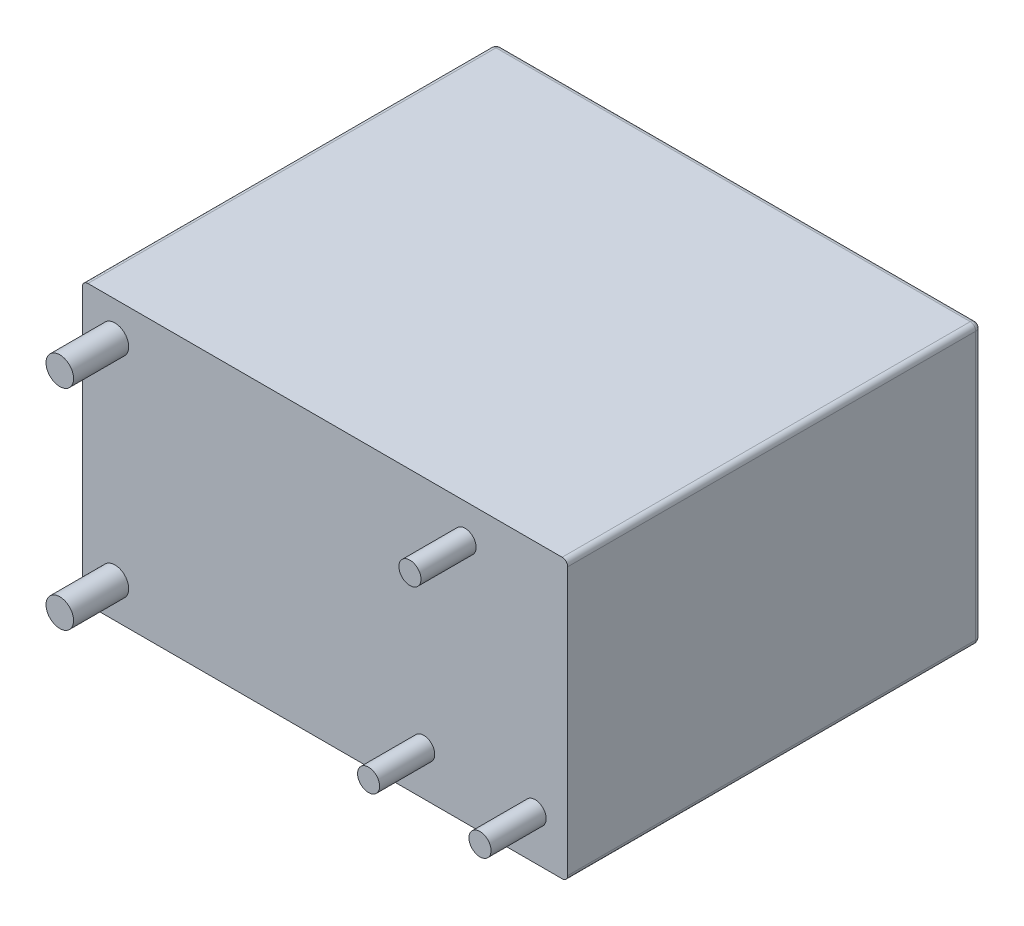
ISO-10303-21;
HEADER;
FILE_DESCRIPTION(('STEP AP214'),'2;1');
FILE_NAME('part.step','',(''),(''),'','','');
FILE_SCHEMA(('AUTOMOTIVE_DESIGN { 1 0 10303 214 1 1 1 1 }'));
ENDSEC;
DATA;
#1=APPLICATION_CONTEXT('core data for automotive mechanical design processes');
#2=APPLICATION_PROTOCOL_DEFINITION('international standard','automotive_design',2000,#1);
#3=PRODUCT_CONTEXT('',#1,'mechanical');
#4=PRODUCT('Part','Part','',(#3));
#5=PRODUCT_RELATED_PRODUCT_CATEGORY('part','',(#4));
#6=PRODUCT_DEFINITION_FORMATION('','',#4);
#7=PRODUCT_DEFINITION_CONTEXT('part definition',#1,'design');
#8=PRODUCT_DEFINITION('design','',#6,#7);
#9=PRODUCT_DEFINITION_SHAPE('','',#8);
#10=(LENGTH_UNIT() NAMED_UNIT(*) SI_UNIT(.MILLI.,.METRE.));
#11=(NAMED_UNIT(*) PLANE_ANGLE_UNIT() SI_UNIT($,.RADIAN.));
#12=(NAMED_UNIT(*) SI_UNIT($,.STERADIAN.) SOLID_ANGLE_UNIT());
#13=UNCERTAINTY_MEASURE_WITH_UNIT(LENGTH_MEASURE(1.E-05),#10,'distance_accuracy_value','');
#14=(GEOMETRIC_REPRESENTATION_CONTEXT(3) GLOBAL_UNCERTAINTY_ASSIGNED_CONTEXT((#13)) GLOBAL_UNIT_ASSIGNED_CONTEXT((#10,
#11,#12)) REPRESENTATION_CONTEXT('',''));
#15=CARTESIAN_POINT('',(0.,0.,0.));
#16=DIRECTION('',(0.,0.,1.));
#17=DIRECTION('',(1.,0.,0.));
#18=AXIS2_PLACEMENT_3D('',#15,#16,#17);
#19=CARTESIAN_POINT('',(0.,0.,-15.));
#20=DIRECTION('',(-1.,0.,0.));
#21=DIRECTION('',(0.,0.,1.));
#22=AXIS2_PLACEMENT_3D('',#19,#20,#21);
#23=PLANE('',#22);
#24=DIRECTION('',(0.,-1.,0.));
#25=VECTOR('',#24,1.);
#26=CARTESIAN_POINT('',(0.,0.,-14.8));
#27=LINE('',#26,#25);
#28=CARTESIAN_POINT('',(0.,9.9,-14.8));
#29=VERTEX_POINT('',#28);
#30=CARTESIAN_POINT('',(0.,0.2,-14.8));
#31=VERTEX_POINT('',#30);
#32=EDGE_CURVE('E156',#29,#31,#27,.T.);
#33=ORIENTED_EDGE('',*,*,#32,.T.);
#34=DIRECTION('',(0.,0.,1.));
#35=VECTOR('',#34,1.);
#36=CARTESIAN_POINT('',(0.,0.2,-15.));
#37=LINE('',#36,#35);
#38=CARTESIAN_POINT('',(0.,0.2,0.));
#39=VERTEX_POINT('',#38);
#40=EDGE_CURVE('E158',#31,#39,#37,.T.);
#41=ORIENTED_EDGE('',*,*,#40,.T.);
#42=DIRECTION('',(0.,-1.,0.));
#43=VECTOR('',#42,1.);
#44=CARTESIAN_POINT('',(0.,0.,0.));
#45=LINE('',#44,#43);
#46=CARTESIAN_POINT('',(0.,9.9,0.));
#47=VERTEX_POINT('',#46);
#48=EDGE_CURVE('E117',#47,#39,#45,.T.);
#49=ORIENTED_EDGE('',*,*,#48,.F.);
#50=DIRECTION('',(0.,0.,1.));
#51=VECTOR('',#50,1.);
#52=CARTESIAN_POINT('',(0.,9.9,-15.));
#53=LINE('',#52,#51);
#54=EDGE_CURVE('E154',#47,#29,#53,.F.);
#55=ORIENTED_EDGE('',*,*,#54,.T.);
#56=EDGE_LOOP('',(#33,#41,#49,#55));
#57=FACE_BOUND('',#56,.T.);
#58=ADVANCED_FACE('F35',(#57),#23,.T.);
#59=CARTESIAN_POINT('',(0.,10.1,-15.));
#60=DIRECTION('',(0.,1.,0.));
#61=DIRECTION('',(0.,0.,1.));
#62=AXIS2_PLACEMENT_3D('',#59,#60,#61);
#63=PLANE('',#62);
#64=DIRECTION('',(-1.,0.,0.));
#65=VECTOR('',#64,1.);
#66=CARTESIAN_POINT('',(0.,10.1,-14.8));
#67=LINE('',#66,#65);
#68=CARTESIAN_POINT('',(17.4,10.1,-14.8));
#69=VERTEX_POINT('',#68);
#70=CARTESIAN_POINT('',(0.2,10.1,-14.8));
#71=VERTEX_POINT('',#70);
#72=EDGE_CURVE('E51',#69,#71,#67,.T.);
#73=ORIENTED_EDGE('',*,*,#72,.T.);
#74=DIRECTION('',(0.,0.,1.));
#75=VECTOR('',#74,1.);
#76=CARTESIAN_POINT('',(0.2,10.1,-15.));
#77=LINE('',#76,#75);
#78=CARTESIAN_POINT('',(0.2,10.1,0.));
#79=VERTEX_POINT('',#78);
#80=EDGE_CURVE('E11',#71,#79,#77,.T.);
#81=ORIENTED_EDGE('',*,*,#80,.T.);
#82=DIRECTION('',(-1.,0.,0.));
#83=VECTOR('',#82,1.);
#84=CARTESIAN_POINT('',(0.,10.1,0.));
#85=LINE('',#84,#83);
#86=CARTESIAN_POINT('',(17.4,10.1,0.));
#87=VERTEX_POINT('',#86);
#88=EDGE_CURVE('E231',#87,#79,#85,.T.);
#89=ORIENTED_EDGE('',*,*,#88,.F.);
#90=DIRECTION('',(0.,0.,1.));
#91=VECTOR('',#90,1.);
#92=CARTESIAN_POINT('',(17.4,10.1,-15.));
#93=LINE('',#92,#91);
#94=EDGE_CURVE('E44',#87,#69,#93,.F.);
#95=ORIENTED_EDGE('',*,*,#94,.T.);
#96=EDGE_LOOP('',(#73,#81,#89,#95));
#97=FACE_BOUND('',#96,.T.);
#98=ADVANCED_FACE('F276',(#97),#63,.T.);
#99=CARTESIAN_POINT('',(17.6,0.,-15.));
#100=DIRECTION('',(1.,0.,0.));
#101=DIRECTION('',(0.,0.,-1.));
#102=AXIS2_PLACEMENT_3D('',#99,#100,#101);
#103=PLANE('',#102);
#104=DIRECTION('',(0.,1.,0.));
#105=VECTOR('',#104,1.);
#106=CARTESIAN_POINT('',(17.6,0.,0.));
#107=LINE('',#106,#105);
#108=CARTESIAN_POINT('',(17.6,0.2,0.));
#109=VERTEX_POINT('',#108);
#110=CARTESIAN_POINT('',(17.6,9.9,0.));
#111=VERTEX_POINT('',#110);
#112=EDGE_CURVE('E131',#109,#111,#107,.T.);
#113=ORIENTED_EDGE('',*,*,#112,.F.);
#114=DIRECTION('',(0.,0.,1.));
#115=VECTOR('',#114,1.);
#116=CARTESIAN_POINT('',(17.6,0.2,-15.));
#117=LINE('',#116,#115);
#118=CARTESIAN_POINT('',(17.6,0.2,-14.8));
#119=VERTEX_POINT('',#118);
#120=EDGE_CURVE('E152',#109,#119,#117,.F.);
#121=ORIENTED_EDGE('',*,*,#120,.T.);
#122=DIRECTION('',(0.,1.,0.));
#123=VECTOR('',#122,1.);
#124=CARTESIAN_POINT('',(17.6,0.,-14.8));
#125=LINE('',#124,#123);
#126=CARTESIAN_POINT('',(17.6,9.9,-14.8));
#127=VERTEX_POINT('',#126);
#128=EDGE_CURVE('E150',#119,#127,#125,.T.);
#129=ORIENTED_EDGE('',*,*,#128,.T.);
#130=DIRECTION('',(0.,0.,1.));
#131=VECTOR('',#130,1.);
#132=CARTESIAN_POINT('',(17.6,9.9,-15.));
#133=LINE('',#132,#131);
#134=EDGE_CURVE('E148',#127,#111,#133,.T.);
#135=ORIENTED_EDGE('',*,*,#134,.T.);
#136=EDGE_LOOP('',(#113,#121,#129,#135));
#137=FACE_BOUND('',#136,.T.);
#138=ADVANCED_FACE('F282',(#137),#103,.T.);
#139=CARTESIAN_POINT('',(0.,0.,-15.));
#140=DIRECTION('',(0.,-1.,0.));
#141=DIRECTION('',(0.,0.,-1.));
#142=AXIS2_PLACEMENT_3D('',#139,#140,#141);
#143=PLANE('',#142);
#144=DIRECTION('',(1.,0.,0.));
#145=VECTOR('',#144,1.);
#146=CARTESIAN_POINT('',(0.,0.,-14.8));
#147=LINE('',#146,#145);
#148=CARTESIAN_POINT('',(0.2,0.,-14.8));
#149=VERTEX_POINT('',#148);
#150=CARTESIAN_POINT('',(17.4,0.,-14.8));
#151=VERTEX_POINT('',#150);
#152=EDGE_CURVE('E137',#149,#151,#147,.T.);
#153=ORIENTED_EDGE('',*,*,#152,.T.);
#154=DIRECTION('',(0.,0.,1.));
#155=VECTOR('',#154,1.);
#156=CARTESIAN_POINT('',(17.4,0.,-15.));
#157=LINE('',#156,#155);
#158=CARTESIAN_POINT('',(17.4,0.,0.));
#159=VERTEX_POINT('',#158);
#160=EDGE_CURVE('E130',#151,#159,#157,.T.);
#161=ORIENTED_EDGE('',*,*,#160,.T.);
#162=DIRECTION('',(1.,0.,0.));
#163=VECTOR('',#162,1.);
#164=CARTESIAN_POINT('',(0.,0.,0.));
#165=LINE('',#164,#163);
#166=CARTESIAN_POINT('',(0.2,0.,0.));
#167=VERTEX_POINT('',#166);
#168=EDGE_CURVE('E115',#167,#159,#165,.T.);
#169=ORIENTED_EDGE('',*,*,#168,.F.);
#170=DIRECTION('',(0.,0.,1.));
#171=VECTOR('',#170,1.);
#172=CARTESIAN_POINT('',(0.2,0.,-15.));
#173=LINE('',#172,#171);
#174=EDGE_CURVE('E127',#167,#149,#173,.F.);
#175=ORIENTED_EDGE('',*,*,#174,.T.);
#176=EDGE_LOOP('',(#153,#161,#169,#175));
#177=FACE_BOUND('',#176,.T.);
#178=ADVANCED_FACE('F126',(#177),#143,.T.);
#179=CARTESIAN_POINT('',(0.,0.,-15.));
#180=DIRECTION('',(0.,0.,-1.));
#181=DIRECTION('',(-1.,0.,0.));
#182=AXIS2_PLACEMENT_3D('',#179,#180,#181);
#183=PLANE('',#182);
#184=CARTESIAN_POINT('',(15.4,8.1,-15.));
#185=DIRECTION('',(0.,0.,-1.));
#186=DIRECTION('',(-1.,0.,0.));
#187=AXIS2_PLACEMENT_3D('',#184,#185,#186);
#188=CIRCLE('',#187,0.500000000000001);
#189=CARTESIAN_POINT('',(14.9,8.1,-15.));
#190=VERTEX_POINT('',#189);
#191=EDGE_CURVE('E217',#190,#190,#188,.T.);
#192=ORIENTED_EDGE('',*,*,#191,.F.);
#193=EDGE_LOOP('',(#192));
#194=FACE_BOUND('',#193,.T.);
#195=DIRECTION('',(0.,1.,0.));
#196=VECTOR('',#195,1.);
#197=CARTESIAN_POINT('',(17.4,0.,-15.));
#198=LINE('',#197,#196);
#199=CARTESIAN_POINT('',(17.4,9.9,-15.));
#200=VERTEX_POINT('',#199);
#201=CARTESIAN_POINT('',(17.4,0.2,-15.));
#202=VERTEX_POINT('',#201);
#203=EDGE_CURVE('E164',#200,#202,#198,.F.);
#204=ORIENTED_EDGE('',*,*,#203,.T.);
#205=DIRECTION('',(1.,0.,0.));
#206=VECTOR('',#205,1.);
#207=CARTESIAN_POINT('',(0.,0.2,-15.));
#208=LINE('',#207,#206);
#209=CARTESIAN_POINT('',(0.2,0.2,-15.));
#210=VERTEX_POINT('',#209);
#211=EDGE_CURVE('E166',#202,#210,#208,.F.);
#212=ORIENTED_EDGE('',*,*,#211,.T.);
#213=DIRECTION('',(0.,-1.,0.));
#214=VECTOR('',#213,1.);
#215=CARTESIAN_POINT('',(0.2,0.,-15.));
#216=LINE('',#215,#214);
#217=CARTESIAN_POINT('',(0.2,9.9,-15.));
#218=VERTEX_POINT('',#217);
#219=EDGE_CURVE('E162',#210,#218,#216,.F.);
#220=ORIENTED_EDGE('',*,*,#219,.T.);
#221=DIRECTION('',(-1.,0.,0.));
#222=VECTOR('',#221,1.);
#223=CARTESIAN_POINT('',(0.,9.9,-15.));
#224=LINE('',#223,#222);
#225=EDGE_CURVE('E160',#218,#200,#224,.F.);
#226=ORIENTED_EDGE('',*,*,#225,.T.);
#227=EDGE_LOOP('',(#204,#212,#220,#226));
#228=FACE_BOUND('',#227,.T.);
#229=ADVANCED_FACE('F253',(#194,#228),#183,.T.);
#230=CARTESIAN_POINT('',(0.,0.,0.));
#231=DIRECTION('',(0.,0.,-1.));
#232=DIRECTION('',(-1.,0.,0.));
#233=AXIS2_PLACEMENT_3D('',#230,#231,#232);
#234=PLANE('',#233);
#235=CARTESIAN_POINT('',(1.18,1.25,0.));
#236=DIRECTION('',(0.,0.,-1.));
#237=DIRECTION('',(-1.,0.,0.));
#238=AXIS2_PLACEMENT_3D('',#235,#236,#237);
#239=CIRCLE('',#238,0.5);
#240=CARTESIAN_POINT('',(0.68,1.25,0.));
#241=VERTEX_POINT('',#240);
#242=EDGE_CURVE('E141',#241,#241,#239,.F.);
#243=ORIENTED_EDGE('',*,*,#242,.F.);
#244=EDGE_LOOP('',(#243));
#245=FACE_BOUND('',#244,.T.);
#246=CARTESIAN_POINT('',(16.42,1.5969825328216,0.));
#247=DIRECTION('',(0.,0.,-1.));
#248=DIRECTION('',(-1.,0.,0.));
#249=AXIS2_PLACEMENT_3D('',#246,#247,#248);
#250=CIRCLE('',#249,0.400000000000001);
#251=CARTESIAN_POINT('',(16.02,1.5969825328216,0.));
#252=VERTEX_POINT('',#251);
#253=EDGE_CURVE('E243',#252,#252,#250,.F.);
#254=ORIENTED_EDGE('',*,*,#253,.F.);
#255=EDGE_LOOP('',(#254));
#256=FACE_BOUND('',#255,.T.);
#257=CARTESIAN_POINT('',(12.38,1.59698253282159,0.));
#258=DIRECTION('',(0.,0.,-1.));
#259=DIRECTION('',(-1.,0.,0.));
#260=AXIS2_PLACEMENT_3D('',#257,#258,#259);
#261=CIRCLE('',#260,0.399999999999999);
#262=CARTESIAN_POINT('',(11.98,1.59698253282159,0.));
#263=VERTEX_POINT('',#262);
#264=EDGE_CURVE('E240',#263,#263,#261,.F.);
#265=ORIENTED_EDGE('',*,*,#264,.F.);
#266=EDGE_LOOP('',(#265));
#267=FACE_BOUND('',#266,.T.);
#268=CARTESIAN_POINT('',(13.88,8.85,0.));
#269=DIRECTION('',(0.,0.,-1.));
#270=DIRECTION('',(-1.,0.,0.));
#271=AXIS2_PLACEMENT_3D('',#268,#269,#270);
#272=CIRCLE('',#271,0.399999999999999);
#273=CARTESIAN_POINT('',(13.48,8.85,0.));
#274=VERTEX_POINT('',#273);
#275=EDGE_CURVE('E237',#274,#274,#272,.F.);
#276=ORIENTED_EDGE('',*,*,#275,.F.);
#277=EDGE_LOOP('',(#276));
#278=FACE_BOUND('',#277,.T.);
#279=CARTESIAN_POINT('',(1.18,8.85,0.));
#280=DIRECTION('',(0.,0.,-1.));
#281=DIRECTION('',(-1.,0.,0.));
#282=AXIS2_PLACEMENT_3D('',#279,#280,#281);
#283=CIRCLE('',#282,0.500000000000001);
#284=CARTESIAN_POINT('',(0.679999999999999,8.85,0.));
#285=VERTEX_POINT('',#284);
#286=EDGE_CURVE('E234',#285,#285,#283,.F.);
#287=ORIENTED_EDGE('',*,*,#286,.F.);
#288=EDGE_LOOP('',(#287));
#289=FACE_BOUND('',#288,.T.);
#290=ORIENTED_EDGE('',*,*,#168,.T.);
#291=CARTESIAN_POINT('',(17.4,0.2,0.));
#292=DIRECTION('',(0.,0.,-1.));
#293=DIRECTION('',(-1.,0.,0.));
#294=AXIS2_PLACEMENT_3D('',#291,#292,#293);
#295=CIRCLE('',#294,0.2);
#296=EDGE_CURVE('E121',#159,#109,#295,.F.);
#297=ORIENTED_EDGE('',*,*,#296,.T.);
#298=ORIENTED_EDGE('',*,*,#112,.T.);
#299=CARTESIAN_POINT('',(17.4,9.9,0.));
#300=DIRECTION('',(0.,0.,-1.));
#301=DIRECTION('',(-1.,0.,0.));
#302=AXIS2_PLACEMENT_3D('',#299,#300,#301);
#303=CIRCLE('',#302,0.2);
#304=EDGE_CURVE('E139',#111,#87,#303,.F.);
#305=ORIENTED_EDGE('',*,*,#304,.T.);
#306=ORIENTED_EDGE('',*,*,#88,.T.);
#307=CARTESIAN_POINT('',(0.2,9.9,0.));
#308=DIRECTION('',(0.,0.,-1.));
#309=DIRECTION('',(-1.,0.,0.));
#310=AXIS2_PLACEMENT_3D('',#307,#308,#309);
#311=CIRCLE('',#310,0.2);
#312=EDGE_CURVE('E122',#79,#47,#311,.F.);
#313=ORIENTED_EDGE('',*,*,#312,.T.);
#314=ORIENTED_EDGE('',*,*,#48,.T.);
#315=CARTESIAN_POINT('',(0.2,0.2,0.));
#316=DIRECTION('',(0.,0.,-1.));
#317=DIRECTION('',(-1.,0.,0.));
#318=AXIS2_PLACEMENT_3D('',#315,#316,#317);
#319=CIRCLE('',#318,0.2);
#320=EDGE_CURVE('E112',#39,#167,#319,.F.);
#321=ORIENTED_EDGE('',*,*,#320,.T.);
#322=EDGE_LOOP('',(#290,#297,#298,#305,#306,#313,#314,#321));
#323=FACE_BOUND('',#322,.T.);
#324=ADVANCED_FACE('F114',(#245,#256,#267,#278,#289,#323),#234,.F.);
#325=CARTESIAN_POINT('',(1.18,8.85,2.));
#326=DIRECTION('',(0.,0.,-1.));
#327=DIRECTION('',(-1.,0.,0.));
#328=AXIS2_PLACEMENT_3D('',#325,#326,#327);
#329=CYLINDRICAL_SURFACE('',#328,0.500000000000001);
#330=CARTESIAN_POINT('',(1.18,8.85,2.));
#331=DIRECTION('',(0.,0.,1.));
#332=DIRECTION('',(1.,0.,0.));
#333=AXIS2_PLACEMENT_3D('',#330,#331,#332);
#334=CIRCLE('',#333,0.500000000000001);
#335=CARTESIAN_POINT('',(1.68,8.85,2.));
#336=VERTEX_POINT('',#335);
#337=EDGE_CURVE('E225',#336,#336,#334,.T.);
#338=ORIENTED_EDGE('',*,*,#337,.F.);
#339=EDGE_LOOP('',(#338));
#340=FACE_BOUND('',#339,.T.);
#341=ORIENTED_EDGE('',*,*,#286,.T.);
#342=EDGE_LOOP('',(#341));
#343=FACE_BOUND('',#342,.T.);
#344=ADVANCED_FACE('F252',(#340,#343),#329,.T.);
#345=CARTESIAN_POINT('',(1.18,8.85,2.));
#346=DIRECTION('',(0.,0.,1.));
#347=DIRECTION('',(1.,0.,0.));
#348=AXIS2_PLACEMENT_3D('',#345,#346,#347);
#349=PLANE('',#348);
#350=ORIENTED_EDGE('',*,*,#337,.T.);
#351=EDGE_LOOP('',(#350));
#352=FACE_BOUND('',#351,.T.);
#353=ADVANCED_FACE('F264',(#352),#349,.T.);
#354=CARTESIAN_POINT('',(13.88,8.85,2.));
#355=DIRECTION('',(0.,0.,-1.));
#356=DIRECTION('',(-1.,0.,0.));
#357=AXIS2_PLACEMENT_3D('',#354,#355,#356);
#358=CYLINDRICAL_SURFACE('',#357,0.399999999999999);
#359=CARTESIAN_POINT('',(13.88,8.85,2.));
#360=DIRECTION('',(0.,0.,1.));
#361=DIRECTION('',(1.,0.,0.));
#362=AXIS2_PLACEMENT_3D('',#359,#360,#361);
#363=CIRCLE('',#362,0.399999999999999);
#364=CARTESIAN_POINT('',(14.28,8.85,2.));
#365=VERTEX_POINT('',#364);
#366=EDGE_CURVE('E222',#365,#365,#363,.T.);
#367=ORIENTED_EDGE('',*,*,#366,.F.);
#368=EDGE_LOOP('',(#367));
#369=FACE_BOUND('',#368,.T.);
#370=ORIENTED_EDGE('',*,*,#275,.T.);
#371=EDGE_LOOP('',(#370));
#372=FACE_BOUND('',#371,.T.);
#373=ADVANCED_FACE('F270',(#369,#372),#358,.T.);
#374=CARTESIAN_POINT('',(13.88,8.85,2.));
#375=DIRECTION('',(0.,0.,1.));
#376=DIRECTION('',(1.,0.,0.));
#377=AXIS2_PLACEMENT_3D('',#374,#375,#376);
#378=PLANE('',#377);
#379=ORIENTED_EDGE('',*,*,#366,.T.);
#380=EDGE_LOOP('',(#379));
#381=FACE_BOUND('',#380,.T.);
#382=ADVANCED_FACE('F395',(#381),#378,.T.);
#383=CARTESIAN_POINT('',(12.38,1.59698253282159,2.));
#384=DIRECTION('',(0.,0.,-1.));
#385=DIRECTION('',(-1.,0.,0.));
#386=AXIS2_PLACEMENT_3D('',#383,#384,#385);
#387=CYLINDRICAL_SURFACE('',#386,0.399999999999999);
#388=CARTESIAN_POINT('',(12.38,1.59698253282159,2.));
#389=DIRECTION('',(0.,0.,1.));
#390=DIRECTION('',(1.,0.,0.));
#391=AXIS2_PLACEMENT_3D('',#388,#389,#390);
#392=CIRCLE('',#391,0.399999999999999);
#393=CARTESIAN_POINT('',(12.78,1.59698253282159,2.));
#394=VERTEX_POINT('',#393);
#395=EDGE_CURVE('E214',#394,#394,#392,.T.);
#396=ORIENTED_EDGE('',*,*,#395,.F.);
#397=EDGE_LOOP('',(#396));
#398=FACE_BOUND('',#397,.T.);
#399=ORIENTED_EDGE('',*,*,#264,.T.);
#400=EDGE_LOOP('',(#399));
#401=FACE_BOUND('',#400,.T.);
#402=ADVANCED_FACE('F391',(#398,#401),#387,.T.);
#403=CARTESIAN_POINT('',(12.38,1.59698253282159,2.));
#404=DIRECTION('',(0.,0.,1.));
#405=DIRECTION('',(1.,0.,0.));
#406=AXIS2_PLACEMENT_3D('',#403,#404,#405);
#407=PLANE('',#406);
#408=ORIENTED_EDGE('',*,*,#395,.T.);
#409=EDGE_LOOP('',(#408));
#410=FACE_BOUND('',#409,.T.);
#411=ADVANCED_FACE('F387',(#410),#407,.T.);
#412=CARTESIAN_POINT('',(16.42,1.5969825328216,2.));
#413=DIRECTION('',(0.,0.,-1.));
#414=DIRECTION('',(-1.,0.,0.));
#415=AXIS2_PLACEMENT_3D('',#412,#413,#414);
#416=CYLINDRICAL_SURFACE('',#415,0.400000000000001);
#417=CARTESIAN_POINT('',(16.42,1.5969825328216,2.));
#418=DIRECTION('',(0.,0.,1.));
#419=DIRECTION('',(1.,0.,0.));
#420=AXIS2_PLACEMENT_3D('',#417,#418,#419);
#421=CIRCLE('',#420,0.400000000000001);
#422=CARTESIAN_POINT('',(16.82,1.5969825328216,2.));
#423=VERTEX_POINT('',#422);
#424=EDGE_CURVE('E209',#423,#423,#421,.T.);
#425=ORIENTED_EDGE('',*,*,#424,.F.);
#426=EDGE_LOOP('',(#425));
#427=FACE_BOUND('',#426,.T.);
#428=ORIENTED_EDGE('',*,*,#253,.T.);
#429=EDGE_LOOP('',(#428));
#430=FACE_BOUND('',#429,.T.);
#431=ADVANCED_FACE('F383',(#427,#430),#416,.T.);
#432=CARTESIAN_POINT('',(16.42,1.5969825328216,2.));
#433=DIRECTION('',(0.,0.,1.));
#434=DIRECTION('',(1.,0.,0.));
#435=AXIS2_PLACEMENT_3D('',#432,#433,#434);
#436=PLANE('',#435);
#437=ORIENTED_EDGE('',*,*,#424,.T.);
#438=EDGE_LOOP('',(#437));
#439=FACE_BOUND('',#438,.T.);
#440=ADVANCED_FACE('F379',(#439),#436,.T.);
#441=CARTESIAN_POINT('',(1.18,1.25,2.));
#442=DIRECTION('',(0.,0.,-1.));
#443=DIRECTION('',(-1.,0.,0.));
#444=AXIS2_PLACEMENT_3D('',#441,#442,#443);
#445=CYLINDRICAL_SURFACE('',#444,0.5);
#446=CARTESIAN_POINT('',(1.18,1.25,2.));
#447=DIRECTION('',(0.,0.,1.));
#448=DIRECTION('',(-1.,0.,0.));
#449=AXIS2_PLACEMENT_3D('',#446,#447,#448);
#450=CIRCLE('',#449,0.5);
#451=CARTESIAN_POINT('',(0.68,1.25,2.));
#452=VERTEX_POINT('',#451);
#453=EDGE_CURVE('E204',#452,#452,#450,.T.);
#454=ORIENTED_EDGE('',*,*,#453,.F.);
#455=EDGE_LOOP('',(#454));
#456=FACE_BOUND('',#455,.T.);
#457=ORIENTED_EDGE('',*,*,#242,.T.);
#458=EDGE_LOOP('',(#457));
#459=FACE_BOUND('',#458,.T.);
#460=ADVANCED_FACE('F248',(#456,#459),#445,.T.);
#461=CARTESIAN_POINT('',(1.18,1.25,2.));
#462=DIRECTION('',(0.,0.,-1.));
#463=DIRECTION('',(-1.,0.,0.));
#464=AXIS2_PLACEMENT_3D('',#461,#462,#463);
#465=PLANE('',#464);
#466=ORIENTED_EDGE('',*,*,#453,.T.);
#467=EDGE_LOOP('',(#466));
#468=FACE_BOUND('',#467,.T.);
#469=ADVANCED_FACE('F329',(#468),#465,.F.);
#470=CARTESIAN_POINT('',(0.2,9.9,-15.));
#471=DIRECTION('',(0.,0.,1.));
#472=DIRECTION('',(1.,0.,0.));
#473=AXIS2_PLACEMENT_3D('',#470,#471,#472);
#474=CYLINDRICAL_SURFACE('',#473,0.2);
#475=CARTESIAN_POINT('',(0.2,9.9,-14.8));
#476=DIRECTION('',(0.,0.,-1.));
#477=DIRECTION('',(-1.,0.,0.));
#478=AXIS2_PLACEMENT_3D('',#475,#476,#477);
#479=CIRCLE('',#478,0.2);
#480=EDGE_CURVE('E39',#29,#71,#479,.T.);
#481=ORIENTED_EDGE('',*,*,#480,.F.);
#482=ORIENTED_EDGE('',*,*,#54,.F.);
#483=ORIENTED_EDGE('',*,*,#312,.F.);
#484=ORIENTED_EDGE('',*,*,#80,.F.);
#485=EDGE_LOOP('',(#481,#482,#483,#484));
#486=FACE_BOUND('',#485,.T.);
#487=ADVANCED_FACE('F37',(#486),#474,.T.);
#488=CARTESIAN_POINT('',(0.2,9.9,-14.8));
#489=DIRECTION('',(0.,0.,1.));
#490=DIRECTION('',(1.,0.,0.));
#491=AXIS2_PLACEMENT_3D('',#488,#489,#490);
#492=SPHERICAL_SURFACE('',#491,0.2);
#493=CARTESIAN_POINT('',(0.2,9.9,-14.8));
#494=DIRECTION('',(0.,1.,0.));
#495=DIRECTION('',(0.,0.,1.));
#496=AXIS2_PLACEMENT_3D('',#493,#494,#495);
#497=CIRCLE('',#496,0.2);
#498=EDGE_CURVE('E196',#29,#218,#497,.F.);
#499=ORIENTED_EDGE('',*,*,#498,.F.);
#500=ORIENTED_EDGE('',*,*,#480,.T.);
#501=CARTESIAN_POINT('',(0.2,9.9,-14.8));
#502=DIRECTION('',(-1.,0.,0.));
#503=DIRECTION('',(0.,0.,1.));
#504=AXIS2_PLACEMENT_3D('',#501,#502,#503);
#505=CIRCLE('',#504,0.2);
#506=EDGE_CURVE('E198',#218,#71,#505,.F.);
#507=ORIENTED_EDGE('',*,*,#506,.F.);
#508=EDGE_LOOP('',(#499,#500,#507));
#509=FACE_BOUND('',#508,.T.);
#510=ADVANCED_FACE('F323',(#509),#492,.T.);
#511=CARTESIAN_POINT('',(17.4,9.9,-15.));
#512=DIRECTION('',(0.,0.,1.));
#513=DIRECTION('',(1.,0.,0.));
#514=AXIS2_PLACEMENT_3D('',#511,#512,#513);
#515=CYLINDRICAL_SURFACE('',#514,0.2);
#516=ORIENTED_EDGE('',*,*,#304,.F.);
#517=ORIENTED_EDGE('',*,*,#134,.F.);
#518=CARTESIAN_POINT('',(17.4,9.9,-14.8));
#519=DIRECTION('',(0.,0.,-1.));
#520=DIRECTION('',(-1.,0.,0.));
#521=AXIS2_PLACEMENT_3D('',#518,#519,#520);
#522=CIRCLE('',#521,0.2);
#523=EDGE_CURVE('E193',#69,#127,#522,.T.);
#524=ORIENTED_EDGE('',*,*,#523,.F.);
#525=ORIENTED_EDGE('',*,*,#94,.F.);
#526=EDGE_LOOP('',(#516,#517,#524,#525));
#527=FACE_BOUND('',#526,.T.);
#528=ADVANCED_FACE('F321',(#527),#515,.T.);
#529=CARTESIAN_POINT('',(0.,9.9,-14.8));
#530=DIRECTION('',(-1.,0.,0.));
#531=DIRECTION('',(0.,0.,1.));
#532=AXIS2_PLACEMENT_3D('',#529,#530,#531);
#533=CYLINDRICAL_SURFACE('',#532,0.2);
#534=ORIENTED_EDGE('',*,*,#506,.T.);
#535=ORIENTED_EDGE('',*,*,#72,.F.);
#536=CARTESIAN_POINT('',(17.4,9.9,-14.8));
#537=DIRECTION('',(1.,0.,0.));
#538=DIRECTION('',(0.,0.,-1.));
#539=AXIS2_PLACEMENT_3D('',#536,#537,#538);
#540=CIRCLE('',#539,0.2);
#541=EDGE_CURVE('E190',#200,#69,#540,.T.);
#542=ORIENTED_EDGE('',*,*,#541,.F.);
#543=ORIENTED_EDGE('',*,*,#225,.F.);
#544=EDGE_LOOP('',(#534,#535,#542,#543));
#545=FACE_BOUND('',#544,.T.);
#546=ADVANCED_FACE('F317',(#545),#533,.T.);
#547=CARTESIAN_POINT('',(0.2,0.,-14.8));
#548=DIRECTION('',(0.,-1.,0.));
#549=DIRECTION('',(0.,0.,-1.));
#550=AXIS2_PLACEMENT_3D('',#547,#548,#549);
#551=CYLINDRICAL_SURFACE('',#550,0.2);
#552=ORIENTED_EDGE('',*,*,#498,.T.);
#553=ORIENTED_EDGE('',*,*,#219,.F.);
#554=CARTESIAN_POINT('',(0.2,0.2,-14.8));
#555=DIRECTION('',(0.,-1.,0.));
#556=DIRECTION('',(0.,0.,-1.));
#557=AXIS2_PLACEMENT_3D('',#554,#555,#556);
#558=CIRCLE('',#557,0.2);
#559=EDGE_CURVE('E187',#31,#210,#558,.T.);
#560=ORIENTED_EDGE('',*,*,#559,.F.);
#561=ORIENTED_EDGE('',*,*,#32,.F.);
#562=EDGE_LOOP('',(#552,#553,#560,#561));
#563=FACE_BOUND('',#562,.T.);
#564=ADVANCED_FACE('F314',(#563),#551,.T.);
#565=CARTESIAN_POINT('',(0.2,0.2,-15.));
#566=DIRECTION('',(0.,0.,1.));
#567=DIRECTION('',(1.,0.,0.));
#568=AXIS2_PLACEMENT_3D('',#565,#566,#567);
#569=CYLINDRICAL_SURFACE('',#568,0.2);
#570=ORIENTED_EDGE('',*,*,#320,.F.);
#571=ORIENTED_EDGE('',*,*,#40,.F.);
#572=CARTESIAN_POINT('',(0.2,0.2,-14.8));
#573=DIRECTION('',(0.,0.,-1.));
#574=DIRECTION('',(-1.,0.,0.));
#575=AXIS2_PLACEMENT_3D('',#572,#573,#574);
#576=CIRCLE('',#575,0.2);
#577=EDGE_CURVE('E135',#149,#31,#576,.T.);
#578=ORIENTED_EDGE('',*,*,#577,.F.);
#579=ORIENTED_EDGE('',*,*,#174,.F.);
#580=EDGE_LOOP('',(#570,#571,#578,#579));
#581=FACE_BOUND('',#580,.T.);
#582=ADVANCED_FACE('F133',(#581),#569,.T.);
#583=CARTESIAN_POINT('',(17.4,9.9,-14.8));
#584=DIRECTION('',(0.,0.,1.));
#585=DIRECTION('',(1.,0.,0.));
#586=AXIS2_PLACEMENT_3D('',#583,#584,#585);
#587=SPHERICAL_SURFACE('',#586,0.2);
#588=ORIENTED_EDGE('',*,*,#541,.T.);
#589=ORIENTED_EDGE('',*,*,#523,.T.);
#590=CARTESIAN_POINT('',(17.4,9.9,-14.8));
#591=DIRECTION('',(0.,1.,0.));
#592=DIRECTION('',(0.,0.,1.));
#593=AXIS2_PLACEMENT_3D('',#590,#591,#592);
#594=CIRCLE('',#593,0.2);
#595=EDGE_CURVE('E183',#200,#127,#594,.F.);
#596=ORIENTED_EDGE('',*,*,#595,.F.);
#597=EDGE_LOOP('',(#588,#589,#596));
#598=FACE_BOUND('',#597,.T.);
#599=ADVANCED_FACE('F307',(#598),#587,.T.);
#600=CARTESIAN_POINT('',(0.2,0.2,-14.8));
#601=DIRECTION('',(0.,0.,1.));
#602=DIRECTION('',(1.,0.,0.));
#603=AXIS2_PLACEMENT_3D('',#600,#601,#602);
#604=SPHERICAL_SURFACE('',#603,0.2);
#605=ORIENTED_EDGE('',*,*,#577,.T.);
#606=ORIENTED_EDGE('',*,*,#559,.T.);
#607=CARTESIAN_POINT('',(0.2,0.2,-14.8));
#608=DIRECTION('',(-1.,0.,0.));
#609=DIRECTION('',(0.,0.,1.));
#610=AXIS2_PLACEMENT_3D('',#607,#608,#609);
#611=CIRCLE('',#610,0.2);
#612=EDGE_CURVE('E181',#149,#210,#611,.F.);
#613=ORIENTED_EDGE('',*,*,#612,.F.);
#614=EDGE_LOOP('',(#605,#606,#613));
#615=FACE_BOUND('',#614,.T.);
#616=ADVANCED_FACE('F303',(#615),#604,.T.);
#617=CARTESIAN_POINT('',(17.4,0.,-14.8));
#618=DIRECTION('',(0.,1.,0.));
#619=DIRECTION('',(0.,0.,1.));
#620=AXIS2_PLACEMENT_3D('',#617,#618,#619);
#621=CYLINDRICAL_SURFACE('',#620,0.2);
#622=ORIENTED_EDGE('',*,*,#595,.T.);
#623=ORIENTED_EDGE('',*,*,#128,.F.);
#624=CARTESIAN_POINT('',(17.4,0.2,-14.8));
#625=DIRECTION('',(0.,-1.,0.));
#626=DIRECTION('',(0.,0.,-1.));
#627=AXIS2_PLACEMENT_3D('',#624,#625,#626);
#628=CIRCLE('',#627,0.2);
#629=EDGE_CURVE('E178',#202,#119,#628,.T.);
#630=ORIENTED_EDGE('',*,*,#629,.F.);
#631=ORIENTED_EDGE('',*,*,#203,.F.);
#632=EDGE_LOOP('',(#622,#623,#630,#631));
#633=FACE_BOUND('',#632,.T.);
#634=ADVANCED_FACE('F299',(#633),#621,.T.);
#635=CARTESIAN_POINT('',(0.,0.2,-14.8));
#636=DIRECTION('',(1.,0.,0.));
#637=DIRECTION('',(0.,0.,-1.));
#638=AXIS2_PLACEMENT_3D('',#635,#636,#637);
#639=CYLINDRICAL_SURFACE('',#638,0.2);
#640=ORIENTED_EDGE('',*,*,#612,.T.);
#641=ORIENTED_EDGE('',*,*,#211,.F.);
#642=CARTESIAN_POINT('',(17.4,0.2,-14.8));
#643=DIRECTION('',(1.,0.,0.));
#644=DIRECTION('',(0.,0.,-1.));
#645=AXIS2_PLACEMENT_3D('',#642,#643,#644);
#646=CIRCLE('',#645,0.2);
#647=EDGE_CURVE('E174',#151,#202,#646,.T.);
#648=ORIENTED_EDGE('',*,*,#647,.F.);
#649=ORIENTED_EDGE('',*,*,#152,.F.);
#650=EDGE_LOOP('',(#640,#641,#648,#649));
#651=FACE_BOUND('',#650,.T.);
#652=ADVANCED_FACE('F295',(#651),#639,.T.);
#653=CARTESIAN_POINT('',(17.4,0.2,-14.8));
#654=DIRECTION('',(0.,0.,1.));
#655=DIRECTION('',(1.,0.,0.));
#656=AXIS2_PLACEMENT_3D('',#653,#654,#655);
#657=SPHERICAL_SURFACE('',#656,0.2);
#658=ORIENTED_EDGE('',*,*,#647,.T.);
#659=ORIENTED_EDGE('',*,*,#629,.T.);
#660=CARTESIAN_POINT('',(17.4,0.2,-14.8));
#661=DIRECTION('',(0.,0.,-1.));
#662=DIRECTION('',(-1.,0.,0.));
#663=AXIS2_PLACEMENT_3D('',#660,#661,#662);
#664=CIRCLE('',#663,0.2);
#665=EDGE_CURVE('E171',#151,#119,#664,.F.);
#666=ORIENTED_EDGE('',*,*,#665,.F.);
#667=EDGE_LOOP('',(#658,#659,#666));
#668=FACE_BOUND('',#667,.T.);
#669=ADVANCED_FACE('F291',(#668),#657,.T.);
#670=CARTESIAN_POINT('',(17.4,0.2,-15.));
#671=DIRECTION('',(0.,0.,1.));
#672=DIRECTION('',(1.,0.,0.));
#673=AXIS2_PLACEMENT_3D('',#670,#671,#672);
#674=CYLINDRICAL_SURFACE('',#673,0.2);
#675=ORIENTED_EDGE('',*,*,#665,.T.);
#676=ORIENTED_EDGE('',*,*,#120,.F.);
#677=ORIENTED_EDGE('',*,*,#296,.F.);
#678=ORIENTED_EDGE('',*,*,#160,.F.);
#679=EDGE_LOOP('',(#675,#676,#677,#678));
#680=FACE_BOUND('',#679,.T.);
#681=ADVANCED_FACE('F287',(#680),#674,.T.);
#682=CARTESIAN_POINT('',(15.4,8.1,-14.5));
#683=DIRECTION('',(0.,0.,-1.));
#684=DIRECTION('',(-1.,0.,0.));
#685=AXIS2_PLACEMENT_3D('',#682,#683,#684);
#686=CYLINDRICAL_SURFACE('',#685,0.500000000000001);
#687=CARTESIAN_POINT('',(15.4,8.1,-14.5));
#688=DIRECTION('',(0.,0.,-1.));
#689=DIRECTION('',(-1.,0.,0.));
#690=AXIS2_PLACEMENT_3D('',#687,#688,#689);
#691=CIRCLE('',#690,0.500000000000001);
#692=CARTESIAN_POINT('',(14.9,8.1,-14.5));
#693=VERTEX_POINT('',#692);
#694=EDGE_CURVE('E175',#693,#693,#691,.T.);
#695=ORIENTED_EDGE('',*,*,#694,.F.);
#696=EDGE_LOOP('',(#695));
#697=FACE_BOUND('',#696,.T.);
#698=ORIENTED_EDGE('',*,*,#191,.T.);
#699=EDGE_LOOP('',(#698));
#700=FACE_BOUND('',#699,.T.);
#701=ADVANCED_FACE('F290',(#697,#700),#686,.F.);
#702=CARTESIAN_POINT('',(15.4,8.1,-14.5));
#703=DIRECTION('',(0.,0.,-1.));
#704=DIRECTION('',(-1.,0.,0.));
#705=AXIS2_PLACEMENT_3D('',#702,#703,#704);
#706=PLANE('',#705);
#707=ORIENTED_EDGE('',*,*,#694,.T.);
#708=EDGE_LOOP('',(#707));
#709=FACE_BOUND('',#708,.T.);
#710=ADVANCED_FACE('F366',(#709),#706,.T.);
#711=CLOSED_SHELL('',(#58,#98,#138,#178,#229,#324,#344,#353,#373,#382,#402,#411,#431,#440,#460,
#469,#487,#510,#528,#546,#564,#582,#599,#616,#634,#652,#669,#681,#701,#710));
#712=MANIFOLD_SOLID_BREP('B2',#711);
#713=ADVANCED_BREP_SHAPE_REPRESENTATION('',(#18,#712),#14);
#714=SHAPE_DEFINITION_REPRESENTATION(#9,#713);
ENDSEC;
END-ISO-10303-21;
